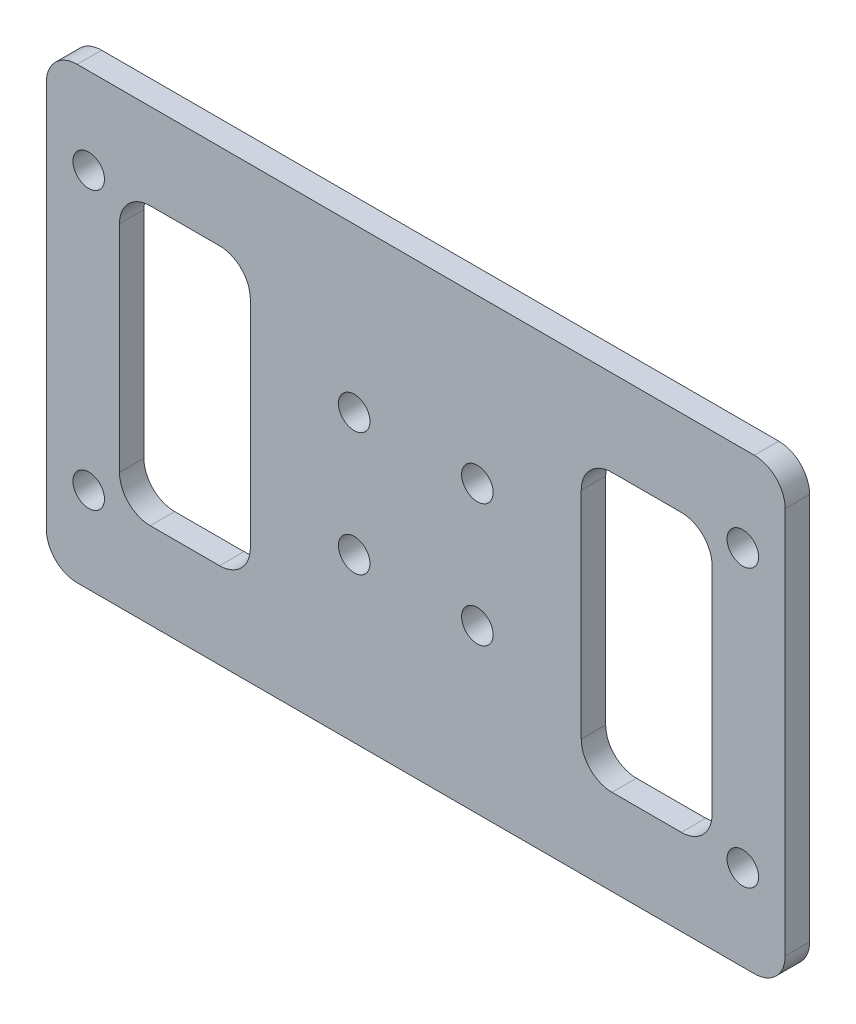
ISO-10303-21;
HEADER;
FILE_DESCRIPTION(('STEP AP214'),'2;1');
FILE_NAME('part.step','',(''),(''),'','','');
FILE_SCHEMA(('AUTOMOTIVE_DESIGN { 1 0 10303 214 1 1 1 1 }'));
ENDSEC;
DATA;
#1=APPLICATION_CONTEXT('core data for automotive mechanical design processes');
#2=APPLICATION_PROTOCOL_DEFINITION('international standard','automotive_design',2000,#1);
#3=PRODUCT_CONTEXT('',#1,'mechanical');
#4=PRODUCT('Part','Part','',(#3));
#5=PRODUCT_RELATED_PRODUCT_CATEGORY('part','',(#4));
#6=PRODUCT_DEFINITION_FORMATION('','',#4);
#7=PRODUCT_DEFINITION_CONTEXT('part definition',#1,'design');
#8=PRODUCT_DEFINITION('design','',#6,#7);
#9=PRODUCT_DEFINITION_SHAPE('','',#8);
#10=(LENGTH_UNIT() NAMED_UNIT(*) SI_UNIT(.MILLI.,.METRE.));
#11=(NAMED_UNIT(*) PLANE_ANGLE_UNIT() SI_UNIT($,.RADIAN.));
#12=(NAMED_UNIT(*) SI_UNIT($,.STERADIAN.) SOLID_ANGLE_UNIT());
#13=UNCERTAINTY_MEASURE_WITH_UNIT(LENGTH_MEASURE(1.E-05),#10,'distance_accuracy_value','');
#14=(GEOMETRIC_REPRESENTATION_CONTEXT(3) GLOBAL_UNCERTAINTY_ASSIGNED_CONTEXT((#13)) GLOBAL_UNIT_ASSIGNED_CONTEXT((#10,
#11,#12)) REPRESENTATION_CONTEXT('',''));
#15=CARTESIAN_POINT('',(0.,0.,0.));
#16=DIRECTION('',(0.,0.,1.));
#17=DIRECTION('',(1.,0.,0.));
#18=AXIS2_PLACEMENT_3D('',#15,#16,#17);
#19=CARTESIAN_POINT('',(0.,0.,3.175));
#20=DIRECTION('',(0.,0.,1.));
#21=DIRECTION('',(1.,0.,0.));
#22=AXIS2_PLACEMENT_3D('',#19,#20,#21);
#23=PLANE('',#22);
#24=CARTESIAN_POINT('',(-8.,8.00000000000001,3.175));
#25=DIRECTION('',(0.,0.,1.));
#26=DIRECTION('',(1.,0.,0.));
#27=AXIS2_PLACEMENT_3D('',#24,#25,#26);
#28=CIRCLE('',#27,2.05);
#29=CARTESIAN_POINT('',(-5.95,8.00000000000001,3.175));
#30=VERTEX_POINT('',#29);
#31=EDGE_CURVE('E395',#30,#30,#28,.T.);
#32=ORIENTED_EDGE('',*,*,#31,.F.);
#33=EDGE_LOOP('',(#32));
#34=FACE_BOUND('',#33,.T.);
#35=CARTESIAN_POINT('',(8.,-7.99999999999999,3.175));
#36=DIRECTION('',(0.,0.,1.));
#37=DIRECTION('',(1.,0.,0.));
#38=AXIS2_PLACEMENT_3D('',#35,#36,#37);
#39=CIRCLE('',#38,2.05);
#40=CARTESIAN_POINT('',(10.05,-7.99999999999999,3.175));
#41=VERTEX_POINT('',#40);
#42=EDGE_CURVE('E407',#41,#41,#39,.T.);
#43=ORIENTED_EDGE('',*,*,#42,.F.);
#44=EDGE_LOOP('',(#43));
#45=FACE_BOUND('',#44,.T.);
#46=CARTESIAN_POINT('',(42.5,18.,3.175));
#47=DIRECTION('',(0.,0.,1.));
#48=DIRECTION('',(1.,0.,0.));
#49=AXIS2_PLACEMENT_3D('',#46,#47,#48);
#50=CIRCLE('',#49,2.04999999999999);
#51=CARTESIAN_POINT('',(44.55,18.,3.175));
#52=VERTEX_POINT('',#51);
#53=EDGE_CURVE('E419',#52,#52,#50,.T.);
#54=ORIENTED_EDGE('',*,*,#53,.F.);
#55=EDGE_LOOP('',(#54));
#56=FACE_BOUND('',#55,.T.);
#57=CARTESIAN_POINT('',(-42.5,-18.,3.175));
#58=DIRECTION('',(0.,0.,1.));
#59=DIRECTION('',(1.,0.,0.));
#60=AXIS2_PLACEMENT_3D('',#57,#58,#59);
#61=CIRCLE('',#60,2.04999999999999);
#62=CARTESIAN_POINT('',(-40.45,-18.,3.175));
#63=VERTEX_POINT('',#62);
#64=EDGE_CURVE('E229',#63,#63,#61,.T.);
#65=ORIENTED_EDGE('',*,*,#64,.F.);
#66=EDGE_LOOP('',(#65));
#67=FACE_BOUND('',#66,.T.);
#68=DIRECTION('',(0.,-1.,0.));
#69=VECTOR('',#68,1.);
#70=CARTESIAN_POINT('',(-48.,-29.175,3.175));
#71=LINE('',#70,#69);
#72=CARTESIAN_POINT('',(-48.,25.175,3.175));
#73=VERTEX_POINT('',#72);
#74=CARTESIAN_POINT('',(-48.,-25.175,3.175));
#75=VERTEX_POINT('',#74);
#76=EDGE_CURVE('E235',#73,#75,#71,.T.);
#77=ORIENTED_EDGE('',*,*,#76,.T.);
#78=CARTESIAN_POINT('',(-44.,-25.175,3.175));
#79=DIRECTION('',(0.,0.,1.));
#80=DIRECTION('',(1.,0.,0.));
#81=AXIS2_PLACEMENT_3D('',#78,#79,#80);
#82=CIRCLE('',#81,4.);
#83=CARTESIAN_POINT('',(-44.,-29.175,3.175));
#84=VERTEX_POINT('',#83);
#85=EDGE_CURVE('E250',#75,#84,#82,.T.);
#86=ORIENTED_EDGE('',*,*,#85,.T.);
#87=DIRECTION('',(1.,0.,0.));
#88=VECTOR('',#87,1.);
#89=CARTESIAN_POINT('',(48.,-29.175,3.175));
#90=LINE('',#89,#88);
#91=CARTESIAN_POINT('',(44.,-29.175,3.175));
#92=VERTEX_POINT('',#91);
#93=EDGE_CURVE('E215',#84,#92,#90,.T.);
#94=ORIENTED_EDGE('',*,*,#93,.T.);
#95=CARTESIAN_POINT('',(44.,-25.175,3.175));
#96=DIRECTION('',(0.,0.,1.));
#97=DIRECTION('',(1.,0.,0.));
#98=AXIS2_PLACEMENT_3D('',#95,#96,#97);
#99=CIRCLE('',#98,4.);
#100=CARTESIAN_POINT('',(48.,-25.175,3.175));
#101=VERTEX_POINT('',#100);
#102=EDGE_CURVE('E246',#92,#101,#99,.T.);
#103=ORIENTED_EDGE('',*,*,#102,.T.);
#104=DIRECTION('',(0.,1.,0.));
#105=VECTOR('',#104,1.);
#106=CARTESIAN_POINT('',(48.,-29.175,3.175));
#107=LINE('',#106,#105);
#108=CARTESIAN_POINT('',(48.,25.175,3.175));
#109=VERTEX_POINT('',#108);
#110=EDGE_CURVE('E438',#101,#109,#107,.T.);
#111=ORIENTED_EDGE('',*,*,#110,.T.);
#112=CARTESIAN_POINT('',(44.,25.175,3.175));
#113=DIRECTION('',(0.,0.,1.));
#114=DIRECTION('',(1.,0.,0.));
#115=AXIS2_PLACEMENT_3D('',#112,#113,#114);
#116=CIRCLE('',#115,4.);
#117=CARTESIAN_POINT('',(44.,29.175,3.175));
#118=VERTEX_POINT('',#117);
#119=EDGE_CURVE('E244',#109,#118,#116,.T.);
#120=ORIENTED_EDGE('',*,*,#119,.T.);
#121=DIRECTION('',(-1.,0.,0.));
#122=VECTOR('',#121,1.);
#123=CARTESIAN_POINT('',(48.,29.175,3.175));
#124=LINE('',#123,#122);
#125=CARTESIAN_POINT('',(-44.,29.175,3.175));
#126=VERTEX_POINT('',#125);
#127=EDGE_CURVE('E236',#118,#126,#124,.T.);
#128=ORIENTED_EDGE('',*,*,#127,.T.);
#129=CARTESIAN_POINT('',(-44.,25.175,3.175));
#130=DIRECTION('',(0.,0.,1.));
#131=DIRECTION('',(1.,0.,0.));
#132=AXIS2_PLACEMENT_3D('',#129,#130,#131);
#133=CIRCLE('',#132,4.);
#134=EDGE_CURVE('E248',#126,#73,#133,.T.);
#135=ORIENTED_EDGE('',*,*,#134,.T.);
#136=EDGE_LOOP('',(#77,#86,#94,#103,#111,#120,#128,#135));
#137=FACE_BOUND('',#136,.T.);
#138=CARTESIAN_POINT('',(-42.5,18.,3.175));
#139=DIRECTION('',(0.,0.,1.));
#140=DIRECTION('',(1.,0.,0.));
#141=AXIS2_PLACEMENT_3D('',#138,#139,#140);
#142=CIRCLE('',#141,2.04999999999999);
#143=CARTESIAN_POINT('',(-40.45,18.,3.175));
#144=VERTEX_POINT('',#143);
#145=EDGE_CURVE('E425',#144,#144,#142,.T.);
#146=ORIENTED_EDGE('',*,*,#145,.F.);
#147=EDGE_LOOP('',(#146));
#148=FACE_BOUND('',#147,.T.);
#149=CARTESIAN_POINT('',(42.5,-18.,3.175));
#150=DIRECTION('',(0.,0.,1.));
#151=DIRECTION('',(1.,0.,0.));
#152=AXIS2_PLACEMENT_3D('',#149,#150,#151);
#153=CIRCLE('',#152,2.04999999999999);
#154=CARTESIAN_POINT('',(44.55,-18.,3.175));
#155=VERTEX_POINT('',#154);
#156=EDGE_CURVE('E413',#155,#155,#153,.T.);
#157=ORIENTED_EDGE('',*,*,#156,.F.);
#158=EDGE_LOOP('',(#157));
#159=FACE_BOUND('',#158,.T.);
#160=CARTESIAN_POINT('',(-8.,-7.99999999999999,3.175));
#161=DIRECTION('',(0.,0.,1.));
#162=DIRECTION('',(1.,0.,0.));
#163=AXIS2_PLACEMENT_3D('',#160,#161,#162);
#164=CIRCLE('',#163,2.05);
#165=CARTESIAN_POINT('',(-5.95,-7.99999999999999,3.175));
#166=VERTEX_POINT('',#165);
#167=EDGE_CURVE('E401',#166,#166,#164,.T.);
#168=ORIENTED_EDGE('',*,*,#167,.F.);
#169=EDGE_LOOP('',(#168));
#170=FACE_BOUND('',#169,.T.);
#171=CARTESIAN_POINT('',(8.,8.00000000000001,3.175));
#172=DIRECTION('',(0.,0.,1.));
#173=DIRECTION('',(1.,0.,0.));
#174=AXIS2_PLACEMENT_3D('',#171,#172,#173);
#175=CIRCLE('',#174,2.05);
#176=CARTESIAN_POINT('',(10.05,8.00000000000001,3.175));
#177=VERTEX_POINT('',#176);
#178=EDGE_CURVE('E389',#177,#177,#175,.T.);
#179=ORIENTED_EDGE('',*,*,#178,.F.);
#180=EDGE_LOOP('',(#179));
#181=FACE_BOUND('',#180,.T.);
#182=DIRECTION('',(0.,-1.,0.));
#183=VECTOR('',#182,1.);
#184=CARTESIAN_POINT('',(-38.5,18.,3.175));
#185=LINE('',#184,#183);
#186=CARTESIAN_POINT('',(-38.5,14.,3.175));
#187=VERTEX_POINT('',#186);
#188=CARTESIAN_POINT('',(-38.5,-14.,3.175));
#189=VERTEX_POINT('',#188);
#190=EDGE_CURVE('E368',#187,#189,#185,.T.);
#191=ORIENTED_EDGE('',*,*,#190,.F.);
#192=CARTESIAN_POINT('',(-34.5,14.,3.175));
#193=DIRECTION('',(0.,0.,1.));
#194=DIRECTION('',(1.,0.,0.));
#195=AXIS2_PLACEMENT_3D('',#192,#193,#194);
#196=CIRCLE('',#195,4.);
#197=CARTESIAN_POINT('',(-34.5,18.,3.175));
#198=VERTEX_POINT('',#197);
#199=EDGE_CURVE('E307',#187,#198,#196,.F.);
#200=ORIENTED_EDGE('',*,*,#199,.T.);
#201=DIRECTION('',(-1.,0.,0.));
#202=VECTOR('',#201,1.);
#203=CARTESIAN_POINT('',(-21.5,18.,3.175));
#204=LINE('',#203,#202);
#205=CARTESIAN_POINT('',(-25.5,18.,3.175));
#206=VERTEX_POINT('',#205);
#207=EDGE_CURVE('E365',#206,#198,#204,.T.);
#208=ORIENTED_EDGE('',*,*,#207,.F.);
#209=CARTESIAN_POINT('',(-25.5,14.,3.175));
#210=DIRECTION('',(0.,0.,1.));
#211=DIRECTION('',(1.,0.,0.));
#212=AXIS2_PLACEMENT_3D('',#209,#210,#211);
#213=CIRCLE('',#212,4.);
#214=CARTESIAN_POINT('',(-21.5,14.,3.175));
#215=VERTEX_POINT('',#214);
#216=EDGE_CURVE('E311',#206,#215,#213,.F.);
#217=ORIENTED_EDGE('',*,*,#216,.T.);
#218=DIRECTION('',(0.,1.,0.));
#219=VECTOR('',#218,1.);
#220=CARTESIAN_POINT('',(-21.5,-18.,3.175));
#221=LINE('',#220,#219);
#222=CARTESIAN_POINT('',(-21.5,-14.,3.175));
#223=VERTEX_POINT('',#222);
#224=EDGE_CURVE('E375',#223,#215,#221,.T.);
#225=ORIENTED_EDGE('',*,*,#224,.F.);
#226=CARTESIAN_POINT('',(-25.5,-14.,3.175));
#227=DIRECTION('',(0.,0.,1.));
#228=DIRECTION('',(1.,0.,0.));
#229=AXIS2_PLACEMENT_3D('',#226,#227,#228);
#230=CIRCLE('',#229,4.);
#231=CARTESIAN_POINT('',(-25.5,-18.,3.175));
#232=VERTEX_POINT('',#231);
#233=EDGE_CURVE('E315',#223,#232,#230,.F.);
#234=ORIENTED_EDGE('',*,*,#233,.T.);
#235=DIRECTION('',(1.,0.,0.));
#236=VECTOR('',#235,1.);
#237=CARTESIAN_POINT('',(-38.5,-18.,3.175));
#238=LINE('',#237,#236);
#239=CARTESIAN_POINT('',(-34.5,-18.,3.175));
#240=VERTEX_POINT('',#239);
#241=EDGE_CURVE('E372',#240,#232,#238,.T.);
#242=ORIENTED_EDGE('',*,*,#241,.F.);
#243=CARTESIAN_POINT('',(-34.5,-14.,3.175));
#244=DIRECTION('',(0.,0.,1.));
#245=DIRECTION('',(1.,0.,0.));
#246=AXIS2_PLACEMENT_3D('',#243,#244,#245);
#247=CIRCLE('',#246,4.);
#248=EDGE_CURVE('E303',#240,#189,#247,.F.);
#249=ORIENTED_EDGE('',*,*,#248,.T.);
#250=EDGE_LOOP('',(#191,#200,#208,#217,#225,#234,#242,#249));
#251=FACE_BOUND('',#250,.T.);
#252=DIRECTION('',(0.,1.,0.));
#253=VECTOR('',#252,1.);
#254=CARTESIAN_POINT('',(38.5,18.,3.175));
#255=LINE('',#254,#253);
#256=CARTESIAN_POINT('',(38.5,-14.,3.175));
#257=VERTEX_POINT('',#256);
#258=CARTESIAN_POINT('',(38.5,14.,3.175));
#259=VERTEX_POINT('',#258);
#260=EDGE_CURVE('E344',#257,#259,#255,.T.);
#261=ORIENTED_EDGE('',*,*,#260,.F.);
#262=CARTESIAN_POINT('',(34.5,-14.,3.175));
#263=DIRECTION('',(0.,0.,1.));
#264=DIRECTION('',(1.,0.,0.));
#265=AXIS2_PLACEMENT_3D('',#262,#263,#264);
#266=CIRCLE('',#265,4.);
#267=CARTESIAN_POINT('',(34.5,-18.,3.175));
#268=VERTEX_POINT('',#267);
#269=EDGE_CURVE('E323',#257,#268,#266,.F.);
#270=ORIENTED_EDGE('',*,*,#269,.T.);
#271=DIRECTION('',(1.,0.,0.));
#272=VECTOR('',#271,1.);
#273=CARTESIAN_POINT('',(38.5,-18.,3.175));
#274=LINE('',#273,#272);
#275=CARTESIAN_POINT('',(25.5,-18.,3.175));
#276=VERTEX_POINT('',#275);
#277=EDGE_CURVE('E350',#276,#268,#274,.T.);
#278=ORIENTED_EDGE('',*,*,#277,.F.);
#279=CARTESIAN_POINT('',(25.5,-14.,3.175));
#280=DIRECTION('',(0.,0.,1.));
#281=DIRECTION('',(1.,0.,0.));
#282=AXIS2_PLACEMENT_3D('',#279,#280,#281);
#283=CIRCLE('',#282,4.);
#284=CARTESIAN_POINT('',(21.5,-14.,3.175));
#285=VERTEX_POINT('',#284);
#286=EDGE_CURVE('E319',#276,#285,#283,.F.);
#287=ORIENTED_EDGE('',*,*,#286,.T.);
#288=DIRECTION('',(0.,-1.,0.));
#289=VECTOR('',#288,1.);
#290=CARTESIAN_POINT('',(21.5,-18.,3.175));
#291=LINE('',#290,#289);
#292=CARTESIAN_POINT('',(21.5,14.,3.175));
#293=VERTEX_POINT('',#292);
#294=EDGE_CURVE('E352',#293,#285,#291,.T.);
#295=ORIENTED_EDGE('',*,*,#294,.F.);
#296=CARTESIAN_POINT('',(25.5,14.,3.175));
#297=DIRECTION('',(0.,0.,1.));
#298=DIRECTION('',(1.,0.,0.));
#299=AXIS2_PLACEMENT_3D('',#296,#297,#298);
#300=CIRCLE('',#299,4.);
#301=CARTESIAN_POINT('',(25.5,18.,3.175));
#302=VERTEX_POINT('',#301);
#303=EDGE_CURVE('E48',#293,#302,#300,.F.);
#304=ORIENTED_EDGE('',*,*,#303,.T.);
#305=DIRECTION('',(-1.,0.,0.));
#306=VECTOR('',#305,1.);
#307=CARTESIAN_POINT('',(21.5,18.,3.175));
#308=LINE('',#307,#306);
#309=CARTESIAN_POINT('',(34.5,18.,3.175));
#310=VERTEX_POINT('',#309);
#311=EDGE_CURVE('E346',#310,#302,#308,.T.);
#312=ORIENTED_EDGE('',*,*,#311,.F.);
#313=CARTESIAN_POINT('',(34.5,14.,3.175));
#314=DIRECTION('',(0.,0.,1.));
#315=DIRECTION('',(1.,0.,0.));
#316=AXIS2_PLACEMENT_3D('',#313,#314,#315);
#317=CIRCLE('',#316,4.);
#318=EDGE_CURVE('E11',#310,#259,#317,.F.);
#319=ORIENTED_EDGE('',*,*,#318,.T.);
#320=EDGE_LOOP('',(#261,#270,#278,#287,#295,#304,#312,#319));
#321=FACE_BOUND('',#320,.T.);
#322=ADVANCED_FACE('F33',(#34,#45,#56,#67,#137,#148,#159,#170,#181,#251,#321),#23,.T.);
#323=CARTESIAN_POINT('',(0.,0.,0.));
#324=DIRECTION('',(0.,0.,1.));
#325=DIRECTION('',(1.,0.,0.));
#326=AXIS2_PLACEMENT_3D('',#323,#324,#325);
#327=PLANE('',#326);
#328=DIRECTION('',(0.,1.,0.));
#329=VECTOR('',#328,1.);
#330=CARTESIAN_POINT('',(-21.5,-18.,0.));
#331=LINE('',#330,#329);
#332=CARTESIAN_POINT('',(-21.5,-14.,0.));
#333=VERTEX_POINT('',#332);
#334=CARTESIAN_POINT('',(-21.5,14.,0.));
#335=VERTEX_POINT('',#334);
#336=EDGE_CURVE('E369',#333,#335,#331,.T.);
#337=ORIENTED_EDGE('',*,*,#336,.T.);
#338=CARTESIAN_POINT('',(-25.5,14.,0.));
#339=DIRECTION('',(0.,0.,1.));
#340=DIRECTION('',(1.,0.,0.));
#341=AXIS2_PLACEMENT_3D('',#338,#339,#340);
#342=CIRCLE('',#341,4.);
#343=CARTESIAN_POINT('',(-25.5,18.,0.));
#344=VERTEX_POINT('',#343);
#345=EDGE_CURVE('E309',#335,#344,#342,.T.);
#346=ORIENTED_EDGE('',*,*,#345,.T.);
#347=DIRECTION('',(-1.,0.,0.));
#348=VECTOR('',#347,1.);
#349=CARTESIAN_POINT('',(-21.5,18.,0.));
#350=LINE('',#349,#348);
#351=CARTESIAN_POINT('',(-34.5,18.,0.));
#352=VERTEX_POINT('',#351);
#353=EDGE_CURVE('E359',#344,#352,#350,.T.);
#354=ORIENTED_EDGE('',*,*,#353,.T.);
#355=CARTESIAN_POINT('',(-34.5,14.,0.));
#356=DIRECTION('',(0.,0.,1.));
#357=DIRECTION('',(1.,0.,0.));
#358=AXIS2_PLACEMENT_3D('',#355,#356,#357);
#359=CIRCLE('',#358,4.);
#360=CARTESIAN_POINT('',(-38.5,14.,0.));
#361=VERTEX_POINT('',#360);
#362=EDGE_CURVE('E305',#352,#361,#359,.T.);
#363=ORIENTED_EDGE('',*,*,#362,.T.);
#364=DIRECTION('',(0.,-1.,0.));
#365=VECTOR('',#364,1.);
#366=CARTESIAN_POINT('',(-38.5,18.,0.));
#367=LINE('',#366,#365);
#368=CARTESIAN_POINT('',(-38.5,-14.,0.));
#369=VERTEX_POINT('',#368);
#370=EDGE_CURVE('E381',#361,#369,#367,.T.);
#371=ORIENTED_EDGE('',*,*,#370,.T.);
#372=CARTESIAN_POINT('',(-34.5,-14.,0.));
#373=DIRECTION('',(0.,0.,1.));
#374=DIRECTION('',(1.,0.,0.));
#375=AXIS2_PLACEMENT_3D('',#372,#373,#374);
#376=CIRCLE('',#375,4.);
#377=CARTESIAN_POINT('',(-34.5,-18.,0.));
#378=VERTEX_POINT('',#377);
#379=EDGE_CURVE('E301',#369,#378,#376,.T.);
#380=ORIENTED_EDGE('',*,*,#379,.T.);
#381=DIRECTION('',(1.,0.,0.));
#382=VECTOR('',#381,1.);
#383=CARTESIAN_POINT('',(-38.5,-18.,0.));
#384=LINE('',#383,#382);
#385=CARTESIAN_POINT('',(-25.5,-18.,0.));
#386=VERTEX_POINT('',#385);
#387=EDGE_CURVE('E384',#378,#386,#384,.T.);
#388=ORIENTED_EDGE('',*,*,#387,.T.);
#389=CARTESIAN_POINT('',(-25.5,-14.,0.));
#390=DIRECTION('',(0.,0.,1.));
#391=DIRECTION('',(1.,0.,0.));
#392=AXIS2_PLACEMENT_3D('',#389,#390,#391);
#393=CIRCLE('',#392,4.);
#394=EDGE_CURVE('E313',#386,#333,#393,.T.);
#395=ORIENTED_EDGE('',*,*,#394,.T.);
#396=EDGE_LOOP('',(#337,#346,#354,#363,#371,#380,#388,#395));
#397=FACE_BOUND('',#396,.T.);
#398=DIRECTION('',(1.,0.,0.));
#399=VECTOR('',#398,1.);
#400=CARTESIAN_POINT('',(48.,-29.175,0.));
#401=LINE('',#400,#399);
#402=CARTESIAN_POINT('',(-44.,-29.175,0.));
#403=VERTEX_POINT('',#402);
#404=CARTESIAN_POINT('',(44.,-29.175,0.));
#405=VERTEX_POINT('',#404);
#406=EDGE_CURVE('E212',#403,#405,#401,.T.);
#407=ORIENTED_EDGE('',*,*,#406,.F.);
#408=CARTESIAN_POINT('',(-44.,-25.175,0.));
#409=DIRECTION('',(0.,0.,1.));
#410=DIRECTION('',(1.,0.,0.));
#411=AXIS2_PLACEMENT_3D('',#408,#409,#410);
#412=CIRCLE('',#411,4.);
#413=CARTESIAN_POINT('',(-48.,-25.175,0.));
#414=VERTEX_POINT('',#413);
#415=EDGE_CURVE('E195',#403,#414,#412,.F.);
#416=ORIENTED_EDGE('',*,*,#415,.T.);
#417=DIRECTION('',(0.,-1.,0.));
#418=VECTOR('',#417,1.);
#419=CARTESIAN_POINT('',(-48.,-29.175,0.));
#420=LINE('',#419,#418);
#421=CARTESIAN_POINT('',(-48.,25.175,0.));
#422=VERTEX_POINT('',#421);
#423=EDGE_CURVE('E224',#422,#414,#420,.T.);
#424=ORIENTED_EDGE('',*,*,#423,.F.);
#425=CARTESIAN_POINT('',(-44.,25.175,0.));
#426=DIRECTION('',(0.,0.,1.));
#427=DIRECTION('',(1.,0.,0.));
#428=AXIS2_PLACEMENT_3D('',#425,#426,#427);
#429=CIRCLE('',#428,4.);
#430=CARTESIAN_POINT('',(-44.,29.175,0.));
#431=VERTEX_POINT('',#430);
#432=EDGE_CURVE('E206',#422,#431,#429,.F.);
#433=ORIENTED_EDGE('',*,*,#432,.T.);
#434=DIRECTION('',(-1.,0.,0.));
#435=VECTOR('',#434,1.);
#436=CARTESIAN_POINT('',(48.,29.175,0.));
#437=LINE('',#436,#435);
#438=CARTESIAN_POINT('',(44.,29.175,0.));
#439=VERTEX_POINT('',#438);
#440=EDGE_CURVE('E227',#439,#431,#437,.T.);
#441=ORIENTED_EDGE('',*,*,#440,.F.);
#442=CARTESIAN_POINT('',(44.,25.175,0.));
#443=DIRECTION('',(0.,0.,1.));
#444=DIRECTION('',(1.,0.,0.));
#445=AXIS2_PLACEMENT_3D('',#442,#443,#444);
#446=CIRCLE('',#445,4.);
#447=CARTESIAN_POINT('',(48.,25.175,0.));
#448=VERTEX_POINT('',#447);
#449=EDGE_CURVE('E216',#439,#448,#446,.F.);
#450=ORIENTED_EDGE('',*,*,#449,.T.);
#451=DIRECTION('',(0.,1.,0.));
#452=VECTOR('',#451,1.);
#453=CARTESIAN_POINT('',(48.,-29.175,0.));
#454=LINE('',#453,#452);
#455=CARTESIAN_POINT('',(48.,-25.175,0.));
#456=VERTEX_POINT('',#455);
#457=EDGE_CURVE('E223',#456,#448,#454,.T.);
#458=ORIENTED_EDGE('',*,*,#457,.F.);
#459=CARTESIAN_POINT('',(44.,-25.175,0.));
#460=DIRECTION('',(0.,0.,1.));
#461=DIRECTION('',(1.,0.,0.));
#462=AXIS2_PLACEMENT_3D('',#459,#460,#461);
#463=CIRCLE('',#462,4.);
#464=EDGE_CURVE('E222',#456,#405,#463,.F.);
#465=ORIENTED_EDGE('',*,*,#464,.T.);
#466=EDGE_LOOP('',(#407,#416,#424,#433,#441,#450,#458,#465));
#467=FACE_BOUND('',#466,.T.);
#468=CARTESIAN_POINT('',(-42.5,-18.,0.));
#469=DIRECTION('',(0.,0.,1.));
#470=DIRECTION('',(1.,0.,0.));
#471=AXIS2_PLACEMENT_3D('',#468,#469,#470);
#472=CIRCLE('',#471,2.04999999999999);
#473=CARTESIAN_POINT('',(-40.45,-18.,0.));
#474=VERTEX_POINT('',#473);
#475=EDGE_CURVE('E428',#474,#474,#472,.T.);
#476=ORIENTED_EDGE('',*,*,#475,.T.);
#477=EDGE_LOOP('',(#476));
#478=FACE_BOUND('',#477,.T.);
#479=CARTESIAN_POINT('',(-42.5,18.,0.));
#480=DIRECTION('',(0.,0.,1.));
#481=DIRECTION('',(1.,0.,0.));
#482=AXIS2_PLACEMENT_3D('',#479,#480,#481);
#483=CIRCLE('',#482,2.04999999999999);
#484=CARTESIAN_POINT('',(-40.45,18.,0.));
#485=VERTEX_POINT('',#484);
#486=EDGE_CURVE('E422',#485,#485,#483,.T.);
#487=ORIENTED_EDGE('',*,*,#486,.T.);
#488=EDGE_LOOP('',(#487));
#489=FACE_BOUND('',#488,.T.);
#490=CARTESIAN_POINT('',(42.5,18.,0.));
#491=DIRECTION('',(0.,0.,1.));
#492=DIRECTION('',(1.,0.,0.));
#493=AXIS2_PLACEMENT_3D('',#490,#491,#492);
#494=CIRCLE('',#493,2.04999999999999);
#495=CARTESIAN_POINT('',(44.55,18.,0.));
#496=VERTEX_POINT('',#495);
#497=EDGE_CURVE('E416',#496,#496,#494,.T.);
#498=ORIENTED_EDGE('',*,*,#497,.T.);
#499=EDGE_LOOP('',(#498));
#500=FACE_BOUND('',#499,.T.);
#501=CARTESIAN_POINT('',(42.5,-18.,0.));
#502=DIRECTION('',(0.,0.,1.));
#503=DIRECTION('',(1.,0.,0.));
#504=AXIS2_PLACEMENT_3D('',#501,#502,#503);
#505=CIRCLE('',#504,2.04999999999999);
#506=CARTESIAN_POINT('',(44.55,-18.,0.));
#507=VERTEX_POINT('',#506);
#508=EDGE_CURVE('E410',#507,#507,#505,.T.);
#509=ORIENTED_EDGE('',*,*,#508,.T.);
#510=EDGE_LOOP('',(#509));
#511=FACE_BOUND('',#510,.T.);
#512=CARTESIAN_POINT('',(8.,-7.99999999999999,0.));
#513=DIRECTION('',(0.,0.,1.));
#514=DIRECTION('',(1.,0.,0.));
#515=AXIS2_PLACEMENT_3D('',#512,#513,#514);
#516=CIRCLE('',#515,2.05);
#517=CARTESIAN_POINT('',(10.05,-7.99999999999999,0.));
#518=VERTEX_POINT('',#517);
#519=EDGE_CURVE('E404',#518,#518,#516,.T.);
#520=ORIENTED_EDGE('',*,*,#519,.T.);
#521=EDGE_LOOP('',(#520));
#522=FACE_BOUND('',#521,.T.);
#523=CARTESIAN_POINT('',(-8.,-7.99999999999999,0.));
#524=DIRECTION('',(0.,0.,1.));
#525=DIRECTION('',(1.,0.,0.));
#526=AXIS2_PLACEMENT_3D('',#523,#524,#525);
#527=CIRCLE('',#526,2.05);
#528=CARTESIAN_POINT('',(-5.95,-7.99999999999999,0.));
#529=VERTEX_POINT('',#528);
#530=EDGE_CURVE('E398',#529,#529,#527,.T.);
#531=ORIENTED_EDGE('',*,*,#530,.T.);
#532=EDGE_LOOP('',(#531));
#533=FACE_BOUND('',#532,.T.);
#534=CARTESIAN_POINT('',(-8.,8.00000000000001,0.));
#535=DIRECTION('',(0.,0.,1.));
#536=DIRECTION('',(1.,0.,0.));
#537=AXIS2_PLACEMENT_3D('',#534,#535,#536);
#538=CIRCLE('',#537,2.05);
#539=CARTESIAN_POINT('',(-5.95,8.00000000000001,0.));
#540=VERTEX_POINT('',#539);
#541=EDGE_CURVE('E392',#540,#540,#538,.T.);
#542=ORIENTED_EDGE('',*,*,#541,.T.);
#543=EDGE_LOOP('',(#542));
#544=FACE_BOUND('',#543,.T.);
#545=CARTESIAN_POINT('',(8.,8.00000000000001,0.));
#546=DIRECTION('',(0.,0.,1.));
#547=DIRECTION('',(1.,0.,0.));
#548=AXIS2_PLACEMENT_3D('',#545,#546,#547);
#549=CIRCLE('',#548,2.05);
#550=CARTESIAN_POINT('',(10.05,8.00000000000001,0.));
#551=VERTEX_POINT('',#550);
#552=EDGE_CURVE('E378',#551,#551,#549,.T.);
#553=ORIENTED_EDGE('',*,*,#552,.T.);
#554=EDGE_LOOP('',(#553));
#555=FACE_BOUND('',#554,.T.);
#556=DIRECTION('',(0.,-1.,0.));
#557=VECTOR('',#556,1.);
#558=CARTESIAN_POINT('',(21.5,-18.,0.));
#559=LINE('',#558,#557);
#560=CARTESIAN_POINT('',(21.5,14.,0.));
#561=VERTEX_POINT('',#560);
#562=CARTESIAN_POINT('',(21.5,-14.,0.));
#563=VERTEX_POINT('',#562);
#564=EDGE_CURVE('E338',#561,#563,#559,.T.);
#565=ORIENTED_EDGE('',*,*,#564,.T.);
#566=CARTESIAN_POINT('',(25.5,-14.,0.));
#567=DIRECTION('',(0.,0.,1.));
#568=DIRECTION('',(1.,0.,0.));
#569=AXIS2_PLACEMENT_3D('',#566,#567,#568);
#570=CIRCLE('',#569,4.);
#571=CARTESIAN_POINT('',(25.5,-18.,0.));
#572=VERTEX_POINT('',#571);
#573=EDGE_CURVE('E317',#563,#572,#570,.T.);
#574=ORIENTED_EDGE('',*,*,#573,.T.);
#575=DIRECTION('',(1.,0.,0.));
#576=VECTOR('',#575,1.);
#577=CARTESIAN_POINT('',(38.5,-18.,0.));
#578=LINE('',#577,#576);
#579=CARTESIAN_POINT('',(34.5,-18.,0.));
#580=VERTEX_POINT('',#579);
#581=EDGE_CURVE('E360',#572,#580,#578,.T.);
#582=ORIENTED_EDGE('',*,*,#581,.T.);
#583=CARTESIAN_POINT('',(34.5,-14.,0.));
#584=DIRECTION('',(0.,0.,1.));
#585=DIRECTION('',(1.,0.,0.));
#586=AXIS2_PLACEMENT_3D('',#583,#584,#585);
#587=CIRCLE('',#586,4.);
#588=CARTESIAN_POINT('',(38.5,-14.,0.));
#589=VERTEX_POINT('',#588);
#590=EDGE_CURVE('E321',#580,#589,#587,.T.);
#591=ORIENTED_EDGE('',*,*,#590,.T.);
#592=DIRECTION('',(0.,1.,0.));
#593=VECTOR('',#592,1.);
#594=CARTESIAN_POINT('',(38.5,18.,0.));
#595=LINE('',#594,#593);
#596=CARTESIAN_POINT('',(38.5,14.,0.));
#597=VERTEX_POINT('',#596);
#598=EDGE_CURVE('E333',#589,#597,#595,.T.);
#599=ORIENTED_EDGE('',*,*,#598,.T.);
#600=CARTESIAN_POINT('',(34.5,14.,0.));
#601=DIRECTION('',(0.,0.,1.));
#602=DIRECTION('',(1.,0.,0.));
#603=AXIS2_PLACEMENT_3D('',#600,#601,#602);
#604=CIRCLE('',#603,4.);
#605=CARTESIAN_POINT('',(34.5,18.,0.));
#606=VERTEX_POINT('',#605);
#607=EDGE_CURVE('E41',#597,#606,#604,.T.);
#608=ORIENTED_EDGE('',*,*,#607,.T.);
#609=DIRECTION('',(-1.,0.,0.));
#610=VECTOR('',#609,1.);
#611=CARTESIAN_POINT('',(21.5,18.,0.));
#612=LINE('',#611,#610);
#613=CARTESIAN_POINT('',(25.5,18.,0.));
#614=VERTEX_POINT('',#613);
#615=EDGE_CURVE('E331',#606,#614,#612,.T.);
#616=ORIENTED_EDGE('',*,*,#615,.T.);
#617=CARTESIAN_POINT('',(25.5,14.,0.));
#618=DIRECTION('',(0.,0.,1.));
#619=DIRECTION('',(1.,0.,0.));
#620=AXIS2_PLACEMENT_3D('',#617,#618,#619);
#621=CIRCLE('',#620,4.);
#622=EDGE_CURVE('E325',#614,#561,#621,.T.);
#623=ORIENTED_EDGE('',*,*,#622,.T.);
#624=EDGE_LOOP('',(#565,#574,#582,#591,#599,#608,#616,#623));
#625=FACE_BOUND('',#624,.T.);
#626=ADVANCED_FACE('F219',(#397,#467,#478,#489,#500,#511,#522,#533,#544,#555,#625),#327,.F.);
#627=CARTESIAN_POINT('',(-48.,-29.175,3.175));
#628=DIRECTION('',(1.,0.,0.));
#629=DIRECTION('',(0.,0.,-1.));
#630=AXIS2_PLACEMENT_3D('',#627,#628,#629);
#631=PLANE('',#630);
#632=ORIENTED_EDGE('',*,*,#423,.T.);
#633=DIRECTION('',(0.,0.,-1.));
#634=VECTOR('',#633,1.);
#635=CARTESIAN_POINT('',(-48.,-25.175,3.175));
#636=LINE('',#635,#634);
#637=EDGE_CURVE('E200',#414,#75,#636,.F.);
#638=ORIENTED_EDGE('',*,*,#637,.T.);
#639=ORIENTED_EDGE('',*,*,#76,.F.);
#640=DIRECTION('',(0.,0.,-1.));
#641=VECTOR('',#640,1.);
#642=CARTESIAN_POINT('',(-48.,25.175,3.175));
#643=LINE('',#642,#641);
#644=EDGE_CURVE('E205',#73,#422,#643,.T.);
#645=ORIENTED_EDGE('',*,*,#644,.T.);
#646=EDGE_LOOP('',(#632,#638,#639,#645));
#647=FACE_BOUND('',#646,.T.);
#648=ADVANCED_FACE('F454',(#647),#631,.F.);
#649=CARTESIAN_POINT('',(48.,-29.175,3.175));
#650=DIRECTION('',(0.,1.,0.));
#651=DIRECTION('',(-1.,0.,0.));
#652=AXIS2_PLACEMENT_3D('',#649,#650,#651);
#653=PLANE('',#652);
#654=ORIENTED_EDGE('',*,*,#93,.F.);
#655=DIRECTION('',(0.,0.,-1.));
#656=VECTOR('',#655,1.);
#657=CARTESIAN_POINT('',(-44.,-29.175,3.175));
#658=LINE('',#657,#656);
#659=EDGE_CURVE('E199',#84,#403,#658,.T.);
#660=ORIENTED_EDGE('',*,*,#659,.T.);
#661=ORIENTED_EDGE('',*,*,#406,.T.);
#662=DIRECTION('',(0.,0.,-1.));
#663=VECTOR('',#662,1.);
#664=CARTESIAN_POINT('',(44.,-29.175,3.175));
#665=LINE('',#664,#663);
#666=EDGE_CURVE('E217',#405,#92,#665,.F.);
#667=ORIENTED_EDGE('',*,*,#666,.T.);
#668=EDGE_LOOP('',(#654,#660,#661,#667));
#669=FACE_BOUND('',#668,.T.);
#670=ADVANCED_FACE('F211',(#669),#653,.F.);
#671=CARTESIAN_POINT('',(48.,-29.175,3.175));
#672=DIRECTION('',(-1.,0.,0.));
#673=DIRECTION('',(0.,-1.,0.));
#674=AXIS2_PLACEMENT_3D('',#671,#672,#673);
#675=PLANE('',#674);
#676=ORIENTED_EDGE('',*,*,#110,.F.);
#677=DIRECTION('',(0.,0.,-1.));
#678=VECTOR('',#677,1.);
#679=CARTESIAN_POINT('',(48.,-25.175,3.175));
#680=LINE('',#679,#678);
#681=EDGE_CURVE('E298',#101,#456,#680,.T.);
#682=ORIENTED_EDGE('',*,*,#681,.T.);
#683=ORIENTED_EDGE('',*,*,#457,.T.);
#684=DIRECTION('',(0.,0.,-1.));
#685=VECTOR('',#684,1.);
#686=CARTESIAN_POINT('',(48.,25.175,3.175));
#687=LINE('',#686,#685);
#688=EDGE_CURVE('E296',#448,#109,#687,.F.);
#689=ORIENTED_EDGE('',*,*,#688,.T.);
#690=EDGE_LOOP('',(#676,#682,#683,#689));
#691=FACE_BOUND('',#690,.T.);
#692=ADVANCED_FACE('F461',(#691),#675,.F.);
#693=CARTESIAN_POINT('',(48.,29.175,3.175));
#694=DIRECTION('',(0.,-1.,0.));
#695=DIRECTION('',(1.,0.,0.));
#696=AXIS2_PLACEMENT_3D('',#693,#694,#695);
#697=PLANE('',#696);
#698=ORIENTED_EDGE('',*,*,#440,.T.);
#699=DIRECTION('',(0.,0.,-1.));
#700=VECTOR('',#699,1.);
#701=CARTESIAN_POINT('',(-44.,29.175,3.175));
#702=LINE('',#701,#700);
#703=EDGE_CURVE('E255',#431,#126,#702,.F.);
#704=ORIENTED_EDGE('',*,*,#703,.T.);
#705=ORIENTED_EDGE('',*,*,#127,.F.);
#706=DIRECTION('',(0.,0.,-1.));
#707=VECTOR('',#706,1.);
#708=CARTESIAN_POINT('',(44.,29.175,3.175));
#709=LINE('',#708,#707);
#710=EDGE_CURVE('E252',#118,#439,#709,.T.);
#711=ORIENTED_EDGE('',*,*,#710,.T.);
#712=EDGE_LOOP('',(#698,#704,#705,#711));
#713=FACE_BOUND('',#712,.T.);
#714=ADVANCED_FACE('F456',(#713),#697,.F.);
#715=CARTESIAN_POINT('',(-42.5,-18.,3.175));
#716=DIRECTION('',(0.,0.,-1.));
#717=DIRECTION('',(-1.,0.,0.));
#718=AXIS2_PLACEMENT_3D('',#715,#716,#717);
#719=CYLINDRICAL_SURFACE('',#718,2.04999999999999);
#720=ORIENTED_EDGE('',*,*,#64,.T.);
#721=EDGE_LOOP('',(#720));
#722=FACE_BOUND('',#721,.T.);
#723=ORIENTED_EDGE('',*,*,#475,.F.);
#724=EDGE_LOOP('',(#723));
#725=FACE_BOUND('',#724,.T.);
#726=ADVANCED_FACE('F484',(#722,#725),#719,.F.);
#727=CARTESIAN_POINT('',(-42.5,18.,3.175));
#728=DIRECTION('',(0.,0.,-1.));
#729=DIRECTION('',(-1.,0.,0.));
#730=AXIS2_PLACEMENT_3D('',#727,#728,#729);
#731=CYLINDRICAL_SURFACE('',#730,2.04999999999999);
#732=ORIENTED_EDGE('',*,*,#145,.T.);
#733=EDGE_LOOP('',(#732));
#734=FACE_BOUND('',#733,.T.);
#735=ORIENTED_EDGE('',*,*,#486,.F.);
#736=EDGE_LOOP('',(#735));
#737=FACE_BOUND('',#736,.T.);
#738=ADVANCED_FACE('F585',(#734,#737),#731,.F.);
#739=CARTESIAN_POINT('',(42.5,18.,3.175));
#740=DIRECTION('',(0.,0.,-1.));
#741=DIRECTION('',(-1.,0.,0.));
#742=AXIS2_PLACEMENT_3D('',#739,#740,#741);
#743=CYLINDRICAL_SURFACE('',#742,2.04999999999999);
#744=ORIENTED_EDGE('',*,*,#53,.T.);
#745=EDGE_LOOP('',(#744));
#746=FACE_BOUND('',#745,.T.);
#747=ORIENTED_EDGE('',*,*,#497,.F.);
#748=EDGE_LOOP('',(#747));
#749=FACE_BOUND('',#748,.T.);
#750=ADVANCED_FACE('F582',(#746,#749),#743,.F.);
#751=CARTESIAN_POINT('',(42.5,-18.,3.175));
#752=DIRECTION('',(0.,0.,-1.));
#753=DIRECTION('',(-1.,0.,0.));
#754=AXIS2_PLACEMENT_3D('',#751,#752,#753);
#755=CYLINDRICAL_SURFACE('',#754,2.04999999999999);
#756=ORIENTED_EDGE('',*,*,#156,.T.);
#757=EDGE_LOOP('',(#756));
#758=FACE_BOUND('',#757,.T.);
#759=ORIENTED_EDGE('',*,*,#508,.F.);
#760=EDGE_LOOP('',(#759));
#761=FACE_BOUND('',#760,.T.);
#762=ADVANCED_FACE('F578',(#758,#761),#755,.F.);
#763=CARTESIAN_POINT('',(8.,-7.99999999999999,3.175));
#764=DIRECTION('',(0.,0.,-1.));
#765=DIRECTION('',(-1.,0.,0.));
#766=AXIS2_PLACEMENT_3D('',#763,#764,#765);
#767=CYLINDRICAL_SURFACE('',#766,2.05);
#768=ORIENTED_EDGE('',*,*,#42,.T.);
#769=EDGE_LOOP('',(#768));
#770=FACE_BOUND('',#769,.T.);
#771=ORIENTED_EDGE('',*,*,#519,.F.);
#772=EDGE_LOOP('',(#771));
#773=FACE_BOUND('',#772,.T.);
#774=ADVANCED_FACE('F574',(#770,#773),#767,.F.);
#775=CARTESIAN_POINT('',(-8.,-7.99999999999999,3.175));
#776=DIRECTION('',(0.,0.,-1.));
#777=DIRECTION('',(-1.,0.,0.));
#778=AXIS2_PLACEMENT_3D('',#775,#776,#777);
#779=CYLINDRICAL_SURFACE('',#778,2.05);
#780=ORIENTED_EDGE('',*,*,#167,.T.);
#781=EDGE_LOOP('',(#780));
#782=FACE_BOUND('',#781,.T.);
#783=ORIENTED_EDGE('',*,*,#530,.F.);
#784=EDGE_LOOP('',(#783));
#785=FACE_BOUND('',#784,.T.);
#786=ADVANCED_FACE('F570',(#782,#785),#779,.F.);
#787=CARTESIAN_POINT('',(-8.,8.00000000000001,3.175));
#788=DIRECTION('',(0.,0.,-1.));
#789=DIRECTION('',(-1.,0.,0.));
#790=AXIS2_PLACEMENT_3D('',#787,#788,#789);
#791=CYLINDRICAL_SURFACE('',#790,2.05);
#792=ORIENTED_EDGE('',*,*,#31,.T.);
#793=EDGE_LOOP('',(#792));
#794=FACE_BOUND('',#793,.T.);
#795=ORIENTED_EDGE('',*,*,#541,.F.);
#796=EDGE_LOOP('',(#795));
#797=FACE_BOUND('',#796,.T.);
#798=ADVANCED_FACE('F566',(#794,#797),#791,.F.);
#799=CARTESIAN_POINT('',(8.,8.00000000000001,3.175));
#800=DIRECTION('',(0.,0.,-1.));
#801=DIRECTION('',(-1.,0.,0.));
#802=AXIS2_PLACEMENT_3D('',#799,#800,#801);
#803=CYLINDRICAL_SURFACE('',#802,2.05);
#804=ORIENTED_EDGE('',*,*,#178,.T.);
#805=EDGE_LOOP('',(#804));
#806=FACE_BOUND('',#805,.T.);
#807=ORIENTED_EDGE('',*,*,#552,.F.);
#808=EDGE_LOOP('',(#807));
#809=FACE_BOUND('',#808,.T.);
#810=ADVANCED_FACE('F562',(#806,#809),#803,.F.);
#811=CARTESIAN_POINT('',(-21.5,18.,3.175));
#812=DIRECTION('',(0.,-1.,0.));
#813=DIRECTION('',(1.,0.,0.));
#814=AXIS2_PLACEMENT_3D('',#811,#812,#813);
#815=PLANE('',#814);
#816=ORIENTED_EDGE('',*,*,#207,.T.);
#817=DIRECTION('',(0.,0.,-1.));
#818=VECTOR('',#817,1.);
#819=CARTESIAN_POINT('',(-34.5,18.,0.));
#820=LINE('',#819,#818);
#821=EDGE_CURVE('E269',#198,#352,#820,.T.);
#822=ORIENTED_EDGE('',*,*,#821,.T.);
#823=ORIENTED_EDGE('',*,*,#353,.F.);
#824=DIRECTION('',(0.,0.,-1.));
#825=VECTOR('',#824,1.);
#826=CARTESIAN_POINT('',(-25.5,18.,3.175));
#827=LINE('',#826,#825);
#828=EDGE_CURVE('E267',#344,#206,#827,.F.);
#829=ORIENTED_EDGE('',*,*,#828,.T.);
#830=EDGE_LOOP('',(#816,#822,#823,#829));
#831=FACE_BOUND('',#830,.T.);
#832=ADVANCED_FACE('F558',(#831),#815,.T.);
#833=CARTESIAN_POINT('',(-38.5,18.,3.175));
#834=DIRECTION('',(1.,0.,0.));
#835=DIRECTION('',(0.,0.,-1.));
#836=AXIS2_PLACEMENT_3D('',#833,#834,#835);
#837=PLANE('',#836);
#838=ORIENTED_EDGE('',*,*,#190,.T.);
#839=DIRECTION('',(0.,0.,-1.));
#840=VECTOR('',#839,1.);
#841=CARTESIAN_POINT('',(-38.5,-14.,0.));
#842=LINE('',#841,#840);
#843=EDGE_CURVE('E259',#189,#369,#842,.T.);
#844=ORIENTED_EDGE('',*,*,#843,.T.);
#845=ORIENTED_EDGE('',*,*,#370,.F.);
#846=DIRECTION('',(0.,0.,-1.));
#847=VECTOR('',#846,1.);
#848=CARTESIAN_POINT('',(-38.5,14.,3.175));
#849=LINE('',#848,#847);
#850=EDGE_CURVE('E257',#361,#187,#849,.F.);
#851=ORIENTED_EDGE('',*,*,#850,.T.);
#852=EDGE_LOOP('',(#838,#844,#845,#851));
#853=FACE_BOUND('',#852,.T.);
#854=ADVANCED_FACE('F554',(#853),#837,.T.);
#855=CARTESIAN_POINT('',(-38.5,-18.,3.175));
#856=DIRECTION('',(0.,1.,0.));
#857=DIRECTION('',(-1.,0.,0.));
#858=AXIS2_PLACEMENT_3D('',#855,#856,#857);
#859=PLANE('',#858);
#860=ORIENTED_EDGE('',*,*,#387,.F.);
#861=DIRECTION('',(0.,0.,-1.));
#862=VECTOR('',#861,1.);
#863=CARTESIAN_POINT('',(-34.5,-18.,3.175));
#864=LINE('',#863,#862);
#865=EDGE_CURVE('E265',#378,#240,#864,.F.);
#866=ORIENTED_EDGE('',*,*,#865,.T.);
#867=ORIENTED_EDGE('',*,*,#241,.T.);
#868=DIRECTION('',(0.,0.,-1.));
#869=VECTOR('',#868,1.);
#870=CARTESIAN_POINT('',(-25.5,-18.,0.));
#871=LINE('',#870,#869);
#872=EDGE_CURVE('E262',#232,#386,#871,.T.);
#873=ORIENTED_EDGE('',*,*,#872,.T.);
#874=EDGE_LOOP('',(#860,#866,#867,#873));
#875=FACE_BOUND('',#874,.T.);
#876=ADVANCED_FACE('F547',(#875),#859,.T.);
#877=CARTESIAN_POINT('',(-21.5,-18.,3.175));
#878=DIRECTION('',(-1.,0.,0.));
#879=DIRECTION('',(0.,0.,1.));
#880=AXIS2_PLACEMENT_3D('',#877,#878,#879);
#881=PLANE('',#880);
#882=ORIENTED_EDGE('',*,*,#224,.T.);
#883=DIRECTION('',(0.,0.,-1.));
#884=VECTOR('',#883,1.);
#885=CARTESIAN_POINT('',(-21.5,14.,0.));
#886=LINE('',#885,#884);
#887=EDGE_CURVE('E274',#215,#335,#886,.T.);
#888=ORIENTED_EDGE('',*,*,#887,.T.);
#889=ORIENTED_EDGE('',*,*,#336,.F.);
#890=DIRECTION('',(0.,0.,-1.));
#891=VECTOR('',#890,1.);
#892=CARTESIAN_POINT('',(-21.5,-14.,3.175));
#893=LINE('',#892,#891);
#894=EDGE_CURVE('E272',#333,#223,#893,.F.);
#895=ORIENTED_EDGE('',*,*,#894,.T.);
#896=EDGE_LOOP('',(#882,#888,#889,#895));
#897=FACE_BOUND('',#896,.T.);
#898=ADVANCED_FACE('F540',(#897),#881,.T.);
#899=CARTESIAN_POINT('',(38.5,-18.,3.175));
#900=DIRECTION('',(0.,1.,0.));
#901=DIRECTION('',(-1.,0.,0.));
#902=AXIS2_PLACEMENT_3D('',#899,#900,#901);
#903=PLANE('',#902);
#904=ORIENTED_EDGE('',*,*,#581,.F.);
#905=DIRECTION('',(0.,0.,-1.));
#906=VECTOR('',#905,1.);
#907=CARTESIAN_POINT('',(25.5,-18.,3.175));
#908=LINE('',#907,#906);
#909=EDGE_CURVE('E285',#572,#276,#908,.F.);
#910=ORIENTED_EDGE('',*,*,#909,.T.);
#911=ORIENTED_EDGE('',*,*,#277,.T.);
#912=DIRECTION('',(0.,0.,-1.));
#913=VECTOR('',#912,1.);
#914=CARTESIAN_POINT('',(34.5,-18.,0.));
#915=LINE('',#914,#913);
#916=EDGE_CURVE('E282',#268,#580,#915,.T.);
#917=ORIENTED_EDGE('',*,*,#916,.T.);
#918=EDGE_LOOP('',(#904,#910,#911,#917));
#919=FACE_BOUND('',#918,.T.);
#920=ADVANCED_FACE('F536',(#919),#903,.T.);
#921=CARTESIAN_POINT('',(38.5,18.,3.175));
#922=DIRECTION('',(-1.,0.,0.));
#923=DIRECTION('',(0.,0.,1.));
#924=AXIS2_PLACEMENT_3D('',#921,#922,#923);
#925=PLANE('',#924);
#926=ORIENTED_EDGE('',*,*,#598,.F.);
#927=DIRECTION('',(0.,0.,-1.));
#928=VECTOR('',#927,1.);
#929=CARTESIAN_POINT('',(38.5,-14.,3.175));
#930=LINE('',#929,#928);
#931=EDGE_CURVE('E290',#589,#257,#930,.F.);
#932=ORIENTED_EDGE('',*,*,#931,.T.);
#933=ORIENTED_EDGE('',*,*,#260,.T.);
#934=DIRECTION('',(0.,0.,-1.));
#935=VECTOR('',#934,1.);
#936=CARTESIAN_POINT('',(38.5,14.,0.));
#937=LINE('',#936,#935);
#938=EDGE_CURVE('E287',#259,#597,#937,.T.);
#939=ORIENTED_EDGE('',*,*,#938,.T.);
#940=EDGE_LOOP('',(#926,#932,#933,#939));
#941=FACE_BOUND('',#940,.T.);
#942=ADVANCED_FACE('F348',(#941),#925,.T.);
#943=CARTESIAN_POINT('',(21.5,18.,3.175));
#944=DIRECTION('',(0.,-1.,0.));
#945=DIRECTION('',(1.,0.,0.));
#946=AXIS2_PLACEMENT_3D('',#943,#944,#945);
#947=PLANE('',#946);
#948=ORIENTED_EDGE('',*,*,#311,.T.);
#949=DIRECTION('',(0.,0.,-1.));
#950=VECTOR('',#949,1.);
#951=CARTESIAN_POINT('',(25.5,18.,0.));
#952=LINE('',#951,#950);
#953=EDGE_CURVE('E293',#302,#614,#952,.T.);
#954=ORIENTED_EDGE('',*,*,#953,.T.);
#955=ORIENTED_EDGE('',*,*,#615,.F.);
#956=DIRECTION('',(0.,0.,-1.));
#957=VECTOR('',#956,1.);
#958=CARTESIAN_POINT('',(34.5,18.,3.175));
#959=LINE('',#958,#957);
#960=EDGE_CURVE('E55',#606,#310,#959,.F.);
#961=ORIENTED_EDGE('',*,*,#960,.T.);
#962=EDGE_LOOP('',(#948,#954,#955,#961));
#963=FACE_BOUND('',#962,.T.);
#964=ADVANCED_FACE('F336',(#963),#947,.T.);
#965=CARTESIAN_POINT('',(21.5,-18.,3.175));
#966=DIRECTION('',(1.,0.,0.));
#967=DIRECTION('',(0.,0.,-1.));
#968=AXIS2_PLACEMENT_3D('',#965,#966,#967);
#969=PLANE('',#968);
#970=ORIENTED_EDGE('',*,*,#294,.T.);
#971=DIRECTION('',(0.,0.,-1.));
#972=VECTOR('',#971,1.);
#973=CARTESIAN_POINT('',(21.5,-14.,0.));
#974=LINE('',#973,#972);
#975=EDGE_CURVE('E279',#285,#563,#974,.T.);
#976=ORIENTED_EDGE('',*,*,#975,.T.);
#977=ORIENTED_EDGE('',*,*,#564,.F.);
#978=DIRECTION('',(0.,0.,-1.));
#979=VECTOR('',#978,1.);
#980=CARTESIAN_POINT('',(21.5,14.,3.175));
#981=LINE('',#980,#979);
#982=EDGE_CURVE('E277',#561,#293,#981,.F.);
#983=ORIENTED_EDGE('',*,*,#982,.T.);
#984=EDGE_LOOP('',(#970,#976,#977,#983));
#985=FACE_BOUND('',#984,.T.);
#986=ADVANCED_FACE('F497',(#985),#969,.T.);
#987=CARTESIAN_POINT('',(-44.,-25.175,3.175));
#988=DIRECTION('',(0.,0.,-1.));
#989=DIRECTION('',(-1.,0.,0.));
#990=AXIS2_PLACEMENT_3D('',#987,#988,#989);
#991=CYLINDRICAL_SURFACE('',#990,4.);
#992=ORIENTED_EDGE('',*,*,#85,.F.);
#993=ORIENTED_EDGE('',*,*,#637,.F.);
#994=ORIENTED_EDGE('',*,*,#415,.F.);
#995=ORIENTED_EDGE('',*,*,#659,.F.);
#996=EDGE_LOOP('',(#992,#993,#994,#995));
#997=FACE_BOUND('',#996,.T.);
#998=ADVANCED_FACE('F198',(#997),#991,.T.);
#999=CARTESIAN_POINT('',(-44.,25.175,3.175));
#1000=DIRECTION('',(0.,0.,-1.));
#1001=DIRECTION('',(-1.,0.,0.));
#1002=AXIS2_PLACEMENT_3D('',#999,#1000,#1001);
#1003=CYLINDRICAL_SURFACE('',#1002,4.);
#1004=ORIENTED_EDGE('',*,*,#134,.F.);
#1005=ORIENTED_EDGE('',*,*,#703,.F.);
#1006=ORIENTED_EDGE('',*,*,#432,.F.);
#1007=ORIENTED_EDGE('',*,*,#644,.F.);
#1008=EDGE_LOOP('',(#1004,#1005,#1006,#1007));
#1009=FACE_BOUND('',#1008,.T.);
#1010=ADVANCED_FACE('F452',(#1009),#1003,.T.);
#1011=CARTESIAN_POINT('',(-34.5,-14.,3.175));
#1012=DIRECTION('',(0.,0.,1.));
#1013=DIRECTION('',(1.,0.,0.));
#1014=AXIS2_PLACEMENT_3D('',#1011,#1012,#1013);
#1015=CYLINDRICAL_SURFACE('',#1014,4.);
#1016=ORIENTED_EDGE('',*,*,#248,.F.);
#1017=ORIENTED_EDGE('',*,*,#865,.F.);
#1018=ORIENTED_EDGE('',*,*,#379,.F.);
#1019=ORIENTED_EDGE('',*,*,#843,.F.);
#1020=EDGE_LOOP('',(#1016,#1017,#1018,#1019));
#1021=FACE_BOUND('',#1020,.T.);
#1022=ADVANCED_FACE('F500',(#1021),#1015,.F.);
#1023=CARTESIAN_POINT('',(-34.5,14.,3.175));
#1024=DIRECTION('',(0.,0.,1.));
#1025=DIRECTION('',(1.,0.,0.));
#1026=AXIS2_PLACEMENT_3D('',#1023,#1024,#1025);
#1027=CYLINDRICAL_SURFACE('',#1026,4.);
#1028=ORIENTED_EDGE('',*,*,#199,.F.);
#1029=ORIENTED_EDGE('',*,*,#850,.F.);
#1030=ORIENTED_EDGE('',*,*,#362,.F.);
#1031=ORIENTED_EDGE('',*,*,#821,.F.);
#1032=EDGE_LOOP('',(#1028,#1029,#1030,#1031));
#1033=FACE_BOUND('',#1032,.T.);
#1034=ADVANCED_FACE('F503',(#1033),#1027,.F.);
#1035=CARTESIAN_POINT('',(-25.5,14.,3.175));
#1036=DIRECTION('',(0.,0.,1.));
#1037=DIRECTION('',(1.,0.,0.));
#1038=AXIS2_PLACEMENT_3D('',#1035,#1036,#1037);
#1039=CYLINDRICAL_SURFACE('',#1038,4.);
#1040=ORIENTED_EDGE('',*,*,#216,.F.);
#1041=ORIENTED_EDGE('',*,*,#828,.F.);
#1042=ORIENTED_EDGE('',*,*,#345,.F.);
#1043=ORIENTED_EDGE('',*,*,#887,.F.);
#1044=EDGE_LOOP('',(#1040,#1041,#1042,#1043));
#1045=FACE_BOUND('',#1044,.T.);
#1046=ADVANCED_FACE('F507',(#1045),#1039,.F.);
#1047=CARTESIAN_POINT('',(-25.5,-14.,3.175));
#1048=DIRECTION('',(0.,0.,1.));
#1049=DIRECTION('',(1.,0.,0.));
#1050=AXIS2_PLACEMENT_3D('',#1047,#1048,#1049);
#1051=CYLINDRICAL_SURFACE('',#1050,4.);
#1052=ORIENTED_EDGE('',*,*,#233,.F.);
#1053=ORIENTED_EDGE('',*,*,#894,.F.);
#1054=ORIENTED_EDGE('',*,*,#394,.F.);
#1055=ORIENTED_EDGE('',*,*,#872,.F.);
#1056=EDGE_LOOP('',(#1052,#1053,#1054,#1055));
#1057=FACE_BOUND('',#1056,.T.);
#1058=ADVANCED_FACE('F511',(#1057),#1051,.F.);
#1059=CARTESIAN_POINT('',(25.5,-14.,3.175));
#1060=DIRECTION('',(0.,0.,1.));
#1061=DIRECTION('',(1.,0.,0.));
#1062=AXIS2_PLACEMENT_3D('',#1059,#1060,#1061);
#1063=CYLINDRICAL_SURFACE('',#1062,4.);
#1064=ORIENTED_EDGE('',*,*,#286,.F.);
#1065=ORIENTED_EDGE('',*,*,#909,.F.);
#1066=ORIENTED_EDGE('',*,*,#573,.F.);
#1067=ORIENTED_EDGE('',*,*,#975,.F.);
#1068=EDGE_LOOP('',(#1064,#1065,#1066,#1067));
#1069=FACE_BOUND('',#1068,.T.);
#1070=ADVANCED_FACE('F515',(#1069),#1063,.F.);
#1071=CARTESIAN_POINT('',(34.5,-14.,3.175));
#1072=DIRECTION('',(0.,0.,1.));
#1073=DIRECTION('',(1.,0.,0.));
#1074=AXIS2_PLACEMENT_3D('',#1071,#1072,#1073);
#1075=CYLINDRICAL_SURFACE('',#1074,4.);
#1076=ORIENTED_EDGE('',*,*,#269,.F.);
#1077=ORIENTED_EDGE('',*,*,#931,.F.);
#1078=ORIENTED_EDGE('',*,*,#590,.F.);
#1079=ORIENTED_EDGE('',*,*,#916,.F.);
#1080=EDGE_LOOP('',(#1076,#1077,#1078,#1079));
#1081=FACE_BOUND('',#1080,.T.);
#1082=ADVANCED_FACE('F519',(#1081),#1075,.F.);
#1083=CARTESIAN_POINT('',(25.5,14.,3.175));
#1084=DIRECTION('',(0.,0.,1.));
#1085=DIRECTION('',(1.,0.,0.));
#1086=AXIS2_PLACEMENT_3D('',#1083,#1084,#1085);
#1087=CYLINDRICAL_SURFACE('',#1086,4.);
#1088=ORIENTED_EDGE('',*,*,#303,.F.);
#1089=ORIENTED_EDGE('',*,*,#982,.F.);
#1090=ORIENTED_EDGE('',*,*,#622,.F.);
#1091=ORIENTED_EDGE('',*,*,#953,.F.);
#1092=EDGE_LOOP('',(#1088,#1089,#1090,#1091));
#1093=FACE_BOUND('',#1092,.T.);
#1094=ADVANCED_FACE('F471',(#1093),#1087,.F.);
#1095=CARTESIAN_POINT('',(34.5,14.,3.175));
#1096=DIRECTION('',(0.,0.,1.));
#1097=DIRECTION('',(1.,0.,0.));
#1098=AXIS2_PLACEMENT_3D('',#1095,#1096,#1097);
#1099=CYLINDRICAL_SURFACE('',#1098,4.);
#1100=ORIENTED_EDGE('',*,*,#318,.F.);
#1101=ORIENTED_EDGE('',*,*,#960,.F.);
#1102=ORIENTED_EDGE('',*,*,#607,.F.);
#1103=ORIENTED_EDGE('',*,*,#938,.F.);
#1104=EDGE_LOOP('',(#1100,#1101,#1102,#1103));
#1105=FACE_BOUND('',#1104,.T.);
#1106=ADVANCED_FACE('F341',(#1105),#1099,.F.);
#1107=CARTESIAN_POINT('',(44.,-25.175,3.175));
#1108=DIRECTION('',(0.,0.,-1.));
#1109=DIRECTION('',(-1.,0.,0.));
#1110=AXIS2_PLACEMENT_3D('',#1107,#1108,#1109);
#1111=CYLINDRICAL_SURFACE('',#1110,4.);
#1112=ORIENTED_EDGE('',*,*,#102,.F.);
#1113=ORIENTED_EDGE('',*,*,#666,.F.);
#1114=ORIENTED_EDGE('',*,*,#464,.F.);
#1115=ORIENTED_EDGE('',*,*,#681,.F.);
#1116=EDGE_LOOP('',(#1112,#1113,#1114,#1115));
#1117=FACE_BOUND('',#1116,.T.);
#1118=ADVANCED_FACE('F465',(#1117),#1111,.T.);
#1119=CARTESIAN_POINT('',(44.,25.175,3.175));
#1120=DIRECTION('',(0.,0.,-1.));
#1121=DIRECTION('',(-1.,0.,0.));
#1122=AXIS2_PLACEMENT_3D('',#1119,#1120,#1121);
#1123=CYLINDRICAL_SURFACE('',#1122,4.);
#1124=ORIENTED_EDGE('',*,*,#119,.F.);
#1125=ORIENTED_EDGE('',*,*,#688,.F.);
#1126=ORIENTED_EDGE('',*,*,#449,.F.);
#1127=ORIENTED_EDGE('',*,*,#710,.F.);
#1128=EDGE_LOOP('',(#1124,#1125,#1126,#1127));
#1129=FACE_BOUND('',#1128,.T.);
#1130=ADVANCED_FACE('F35',(#1129),#1123,.T.);
#1131=CLOSED_SHELL('',(#322,#626,#648,#670,#692,#714,#726,#738,#750,#762,#774,#786,#798,#810,
#832,#854,#876,#898,#920,#942,#964,#986,#998,#1010,#1022,#1034,#1046,#1058,#1070,#1082,#1094,
#1106,#1118,#1130));
#1132=MANIFOLD_SOLID_BREP('B2',#1131);
#1133=ADVANCED_BREP_SHAPE_REPRESENTATION('',(#18,#1132),#14);
#1134=SHAPE_DEFINITION_REPRESENTATION(#9,#1133);
ENDSEC;
END-ISO-10303-21;
